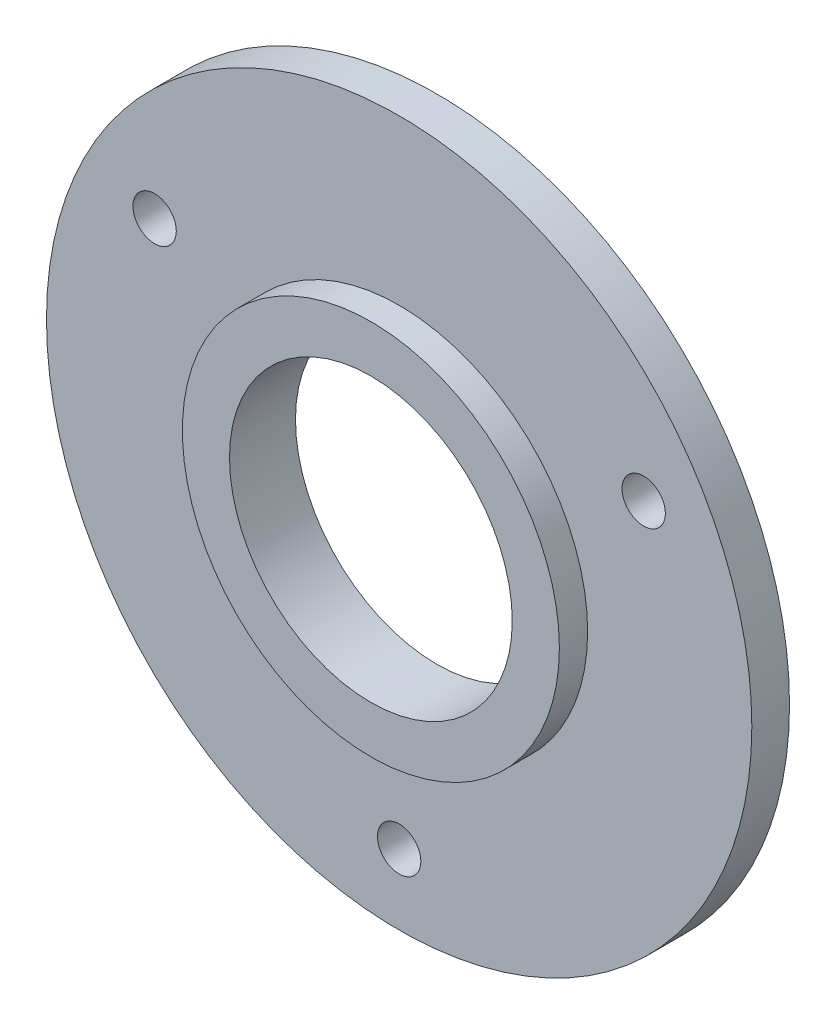
ISO-10303-21;
HEADER;
FILE_DESCRIPTION(('STEP AP214'),'2;1');
FILE_NAME('part.step','',(''),(''),'','','');
FILE_SCHEMA(('AUTOMOTIVE_DESIGN { 1 0 10303 214 1 1 1 1 }'));
ENDSEC;
DATA;
#1=APPLICATION_CONTEXT('core data for automotive mechanical design processes');
#2=APPLICATION_PROTOCOL_DEFINITION('international standard','automotive_design',2000,#1);
#3=PRODUCT_CONTEXT('',#1,'mechanical');
#4=PRODUCT('Part','Part','',(#3));
#5=PRODUCT_RELATED_PRODUCT_CATEGORY('part','',(#4));
#6=PRODUCT_DEFINITION_FORMATION('','',#4);
#7=PRODUCT_DEFINITION_CONTEXT('part definition',#1,'design');
#8=PRODUCT_DEFINITION('design','',#6,#7);
#9=PRODUCT_DEFINITION_SHAPE('','',#8);
#10=(LENGTH_UNIT() NAMED_UNIT(*) SI_UNIT(.MILLI.,.METRE.));
#11=(NAMED_UNIT(*) PLANE_ANGLE_UNIT() SI_UNIT($,.RADIAN.));
#12=(NAMED_UNIT(*) SI_UNIT($,.STERADIAN.) SOLID_ANGLE_UNIT());
#13=UNCERTAINTY_MEASURE_WITH_UNIT(LENGTH_MEASURE(1.E-05),#10,'distance_accuracy_value','');
#14=(GEOMETRIC_REPRESENTATION_CONTEXT(3) GLOBAL_UNCERTAINTY_ASSIGNED_CONTEXT((#13)) GLOBAL_UNIT_ASSIGNED_CONTEXT((#10,
#11,#12)) REPRESENTATION_CONTEXT('',''));
#15=CARTESIAN_POINT('',(0.,0.,0.));
#16=DIRECTION('',(0.,0.,1.));
#17=DIRECTION('',(1.,0.,0.));
#18=AXIS2_PLACEMENT_3D('',#15,#16,#17);
#19=CARTESIAN_POINT('',(0.,0.,2.));
#20=DIRECTION('',(0.,0.,1.));
#21=DIRECTION('',(1.,0.,0.));
#22=AXIS2_PLACEMENT_3D('',#19,#20,#21);
#23=PLANE('',#22);
#24=CARTESIAN_POINT('',(12.9730605486909,7.49000000000001,2.));
#25=DIRECTION('',(0.,0.,1.));
#26=DIRECTION('',(1.,0.,0.));
#27=AXIS2_PLACEMENT_3D('',#24,#25,#26);
#28=CIRCLE('',#27,1.15);
#29=CARTESIAN_POINT('',(14.1230605486909,7.49000000000001,2.));
#30=VERTEX_POINT('',#29);
#31=EDGE_CURVE('E60',#30,#30,#28,.T.);
#32=ORIENTED_EDGE('',*,*,#31,.F.);
#33=EDGE_LOOP('',(#32));
#34=FACE_BOUND('',#33,.T.);
#35=CARTESIAN_POINT('',(-12.9730605486909,7.49,2.));
#36=DIRECTION('',(0.,0.,1.));
#37=DIRECTION('',(1.,0.,0.));
#38=AXIS2_PLACEMENT_3D('',#35,#36,#37);
#39=CIRCLE('',#38,1.15);
#40=CARTESIAN_POINT('',(-11.8230605486909,7.49,2.));
#41=VERTEX_POINT('',#40);
#42=EDGE_CURVE('E49',#41,#41,#39,.T.);
#43=ORIENTED_EDGE('',*,*,#42,.F.);
#44=EDGE_LOOP('',(#43));
#45=FACE_BOUND('',#44,.T.);
#46=CARTESIAN_POINT('',(0.,0.,2.));
#47=DIRECTION('',(0.,0.,1.));
#48=DIRECTION('',(1.,0.,0.));
#49=AXIS2_PLACEMENT_3D('',#46,#47,#48);
#50=CIRCLE('',#49,18.71);
#51=CARTESIAN_POINT('',(18.71,0.,2.));
#52=VERTEX_POINT('',#51);
#53=EDGE_CURVE('E10',#52,#52,#50,.T.);
#54=ORIENTED_EDGE('',*,*,#53,.T.);
#55=EDGE_LOOP('',(#54));
#56=FACE_BOUND('',#55,.T.);
#57=CARTESIAN_POINT('',(0.,-14.98,2.));
#58=DIRECTION('',(0.,0.,1.));
#59=DIRECTION('',(1.,0.,0.));
#60=AXIS2_PLACEMENT_3D('',#57,#58,#59);
#61=CIRCLE('',#60,1.15);
#62=CARTESIAN_POINT('',(1.15,-14.98,2.));
#63=VERTEX_POINT('',#62);
#64=EDGE_CURVE('E44',#63,#63,#61,.T.);
#65=ORIENTED_EDGE('',*,*,#64,.F.);
#66=EDGE_LOOP('',(#65));
#67=FACE_BOUND('',#66,.T.);
#68=CARTESIAN_POINT('',(0.,0.,2.));
#69=DIRECTION('',(0.,0.,1.));
#70=DIRECTION('',(1.,0.,0.));
#71=AXIS2_PLACEMENT_3D('',#68,#69,#70);
#72=CIRCLE('',#71,10.);
#73=CARTESIAN_POINT('',(10.,0.,2.));
#74=VERTEX_POINT('',#73);
#75=EDGE_CURVE('E67',#74,#74,#72,.T.);
#76=ORIENTED_EDGE('',*,*,#75,.F.);
#77=EDGE_LOOP('',(#76));
#78=FACE_BOUND('',#77,.T.);
#79=ADVANCED_FACE('F33',(#34,#45,#56,#67,#78),#23,.T.);
#80=CARTESIAN_POINT('',(0.,0.,0.));
#81=DIRECTION('',(0.,0.,1.));
#82=DIRECTION('',(1.,0.,0.));
#83=AXIS2_PLACEMENT_3D('',#80,#81,#82);
#84=PLANE('',#83);
#85=CARTESIAN_POINT('',(0.,0.,0.));
#86=DIRECTION('',(0.,0.,1.));
#87=DIRECTION('',(1.,0.,0.));
#88=AXIS2_PLACEMENT_3D('',#85,#86,#87);
#89=CIRCLE('',#88,18.71);
#90=CARTESIAN_POINT('',(18.71,0.,0.));
#91=VERTEX_POINT('',#90);
#92=EDGE_CURVE('E37',#91,#91,#89,.T.);
#93=ORIENTED_EDGE('',*,*,#92,.F.);
#94=EDGE_LOOP('',(#93));
#95=FACE_BOUND('',#94,.T.);
#96=CARTESIAN_POINT('',(0.,-14.98,0.));
#97=DIRECTION('',(0.,0.,1.));
#98=DIRECTION('',(1.,0.,0.));
#99=AXIS2_PLACEMENT_3D('',#96,#97,#98);
#100=CIRCLE('',#99,1.15);
#101=CARTESIAN_POINT('',(1.15,-14.98,0.));
#102=VERTEX_POINT('',#101);
#103=EDGE_CURVE('E46',#102,#102,#100,.T.);
#104=ORIENTED_EDGE('',*,*,#103,.T.);
#105=EDGE_LOOP('',(#104));
#106=FACE_BOUND('',#105,.T.);
#107=CARTESIAN_POINT('',(-12.9730605486909,7.49,0.));
#108=DIRECTION('',(0.,0.,1.));
#109=DIRECTION('',(1.,0.,0.));
#110=AXIS2_PLACEMENT_3D('',#107,#108,#109);
#111=CIRCLE('',#110,1.15);
#112=CARTESIAN_POINT('',(-11.8230605486909,7.49,0.));
#113=VERTEX_POINT('',#112);
#114=EDGE_CURVE('E52',#113,#113,#111,.T.);
#115=ORIENTED_EDGE('',*,*,#114,.T.);
#116=EDGE_LOOP('',(#115));
#117=FACE_BOUND('',#116,.T.);
#118=CARTESIAN_POINT('',(0.,0.,0.));
#119=DIRECTION('',(0.,0.,1.));
#120=DIRECTION('',(1.,0.,0.));
#121=AXIS2_PLACEMENT_3D('',#118,#119,#120);
#122=CIRCLE('',#121,7.5);
#123=CARTESIAN_POINT('',(7.5,0.,0.));
#124=VERTEX_POINT('',#123);
#125=EDGE_CURVE('E55',#124,#124,#122,.T.);
#126=ORIENTED_EDGE('',*,*,#125,.T.);
#127=EDGE_LOOP('',(#126));
#128=FACE_BOUND('',#127,.T.);
#129=CARTESIAN_POINT('',(12.9730605486909,7.49000000000001,0.));
#130=DIRECTION('',(0.,0.,1.));
#131=DIRECTION('',(1.,0.,0.));
#132=AXIS2_PLACEMENT_3D('',#129,#130,#131);
#133=CIRCLE('',#132,1.15);
#134=CARTESIAN_POINT('',(14.1230605486909,7.49000000000001,0.));
#135=VERTEX_POINT('',#134);
#136=EDGE_CURVE('E61',#135,#135,#133,.T.);
#137=ORIENTED_EDGE('',*,*,#136,.T.);
#138=EDGE_LOOP('',(#137));
#139=FACE_BOUND('',#138,.T.);
#140=ADVANCED_FACE('F93',(#95,#106,#117,#128,#139),#84,.F.);
#141=CARTESIAN_POINT('',(0.,0.,2.));
#142=DIRECTION('',(0.,0.,-1.));
#143=DIRECTION('',(-1.,0.,0.));
#144=AXIS2_PLACEMENT_3D('',#141,#142,#143);
#145=CYLINDRICAL_SURFACE('',#144,18.71);
#146=ORIENTED_EDGE('',*,*,#53,.F.);
#147=EDGE_LOOP('',(#146));
#148=FACE_BOUND('',#147,.T.);
#149=ORIENTED_EDGE('',*,*,#92,.T.);
#150=EDGE_LOOP('',(#149));
#151=FACE_BOUND('',#150,.T.);
#152=ADVANCED_FACE('F35',(#148,#151),#145,.T.);
#153=CARTESIAN_POINT('',(0.,-14.98,2.));
#154=DIRECTION('',(0.,0.,-1.));
#155=DIRECTION('',(-1.,0.,0.));
#156=AXIS2_PLACEMENT_3D('',#153,#154,#155);
#157=CYLINDRICAL_SURFACE('',#156,1.15);
#158=ORIENTED_EDGE('',*,*,#64,.T.);
#159=EDGE_LOOP('',(#158));
#160=FACE_BOUND('',#159,.T.);
#161=ORIENTED_EDGE('',*,*,#103,.F.);
#162=EDGE_LOOP('',(#161));
#163=FACE_BOUND('',#162,.T.);
#164=ADVANCED_FACE('F103',(#160,#163),#157,.F.);
#165=CARTESIAN_POINT('',(-12.9730605486909,7.49,2.));
#166=DIRECTION('',(0.,0.,-1.));
#167=DIRECTION('',(-1.,0.,0.));
#168=AXIS2_PLACEMENT_3D('',#165,#166,#167);
#169=CYLINDRICAL_SURFACE('',#168,1.15);
#170=ORIENTED_EDGE('',*,*,#42,.T.);
#171=EDGE_LOOP('',(#170));
#172=FACE_BOUND('',#171,.T.);
#173=ORIENTED_EDGE('',*,*,#114,.F.);
#174=EDGE_LOOP('',(#173));
#175=FACE_BOUND('',#174,.T.);
#176=ADVANCED_FACE('F106',(#172,#175),#169,.F.);
#177=CARTESIAN_POINT('',(0.,0.,2.));
#178=DIRECTION('',(0.,0.,-1.));
#179=DIRECTION('',(-1.,0.,0.));
#180=AXIS2_PLACEMENT_3D('',#177,#178,#179);
#181=CYLINDRICAL_SURFACE('',#180,7.5);
#182=ORIENTED_EDGE('',*,*,#125,.F.);
#183=EDGE_LOOP('',(#182));
#184=FACE_BOUND('',#183,.T.);
#185=CARTESIAN_POINT('',(0.,0.,3.5));
#186=DIRECTION('',(0.,0.,1.));
#187=DIRECTION('',(1.,0.,0.));
#188=AXIS2_PLACEMENT_3D('',#185,#186,#187);
#189=CIRCLE('',#188,7.5);
#190=CARTESIAN_POINT('',(7.5,0.,3.5));
#191=VERTEX_POINT('',#190);
#192=EDGE_CURVE('E70',#191,#191,#189,.T.);
#193=ORIENTED_EDGE('',*,*,#192,.T.);
#194=EDGE_LOOP('',(#193));
#195=FACE_BOUND('',#194,.T.);
#196=ADVANCED_FACE('F76',(#184,#195),#181,.F.);
#197=CARTESIAN_POINT('',(12.9730605486909,7.49000000000001,2.));
#198=DIRECTION('',(0.,0.,-1.));
#199=DIRECTION('',(-1.,0.,0.));
#200=AXIS2_PLACEMENT_3D('',#197,#198,#199);
#201=CYLINDRICAL_SURFACE('',#200,1.15);
#202=ORIENTED_EDGE('',*,*,#31,.T.);
#203=EDGE_LOOP('',(#202));
#204=FACE_BOUND('',#203,.T.);
#205=ORIENTED_EDGE('',*,*,#136,.F.);
#206=EDGE_LOOP('',(#205));
#207=FACE_BOUND('',#206,.T.);
#208=ADVANCED_FACE('F81',(#204,#207),#201,.F.);
#209=CARTESIAN_POINT('',(0.,0.,3.5));
#210=DIRECTION('',(0.,0.,1.));
#211=DIRECTION('',(1.,0.,0.));
#212=AXIS2_PLACEMENT_3D('',#209,#210,#211);
#213=PLANE('',#212);
#214=CARTESIAN_POINT('',(0.,0.,3.5));
#215=DIRECTION('',(0.,0.,1.));
#216=DIRECTION('',(1.,0.,0.));
#217=AXIS2_PLACEMENT_3D('',#214,#215,#216);
#218=CIRCLE('',#217,10.);
#219=CARTESIAN_POINT('',(10.,0.,3.5));
#220=VERTEX_POINT('',#219);
#221=EDGE_CURVE('E64',#220,#220,#218,.T.);
#222=ORIENTED_EDGE('',*,*,#221,.T.);
#223=EDGE_LOOP('',(#222));
#224=FACE_BOUND('',#223,.T.);
#225=ORIENTED_EDGE('',*,*,#192,.F.);
#226=EDGE_LOOP('',(#225));
#227=FACE_BOUND('',#226,.T.);
#228=ADVANCED_FACE('F78',(#224,#227),#213,.T.);
#229=CARTESIAN_POINT('',(0.,0.,3.5));
#230=DIRECTION('',(0.,0.,-1.));
#231=DIRECTION('',(-1.,0.,0.));
#232=AXIS2_PLACEMENT_3D('',#229,#230,#231);
#233=CYLINDRICAL_SURFACE('',#232,10.);
#234=ORIENTED_EDGE('',*,*,#221,.F.);
#235=EDGE_LOOP('',(#234));
#236=FACE_BOUND('',#235,.T.);
#237=ORIENTED_EDGE('',*,*,#75,.T.);
#238=EDGE_LOOP('',(#237));
#239=FACE_BOUND('',#238,.T.);
#240=ADVANCED_FACE('F80',(#236,#239),#233,.T.);
#241=CLOSED_SHELL('',(#79,#140,#152,#164,#176,#196,#208,#228,#240));
#242=MANIFOLD_SOLID_BREP('B2',#241);
#243=ADVANCED_BREP_SHAPE_REPRESENTATION('',(#18,#242),#14);
#244=SHAPE_DEFINITION_REPRESENTATION(#9,#243);
ENDSEC;
END-ISO-10303-21;
